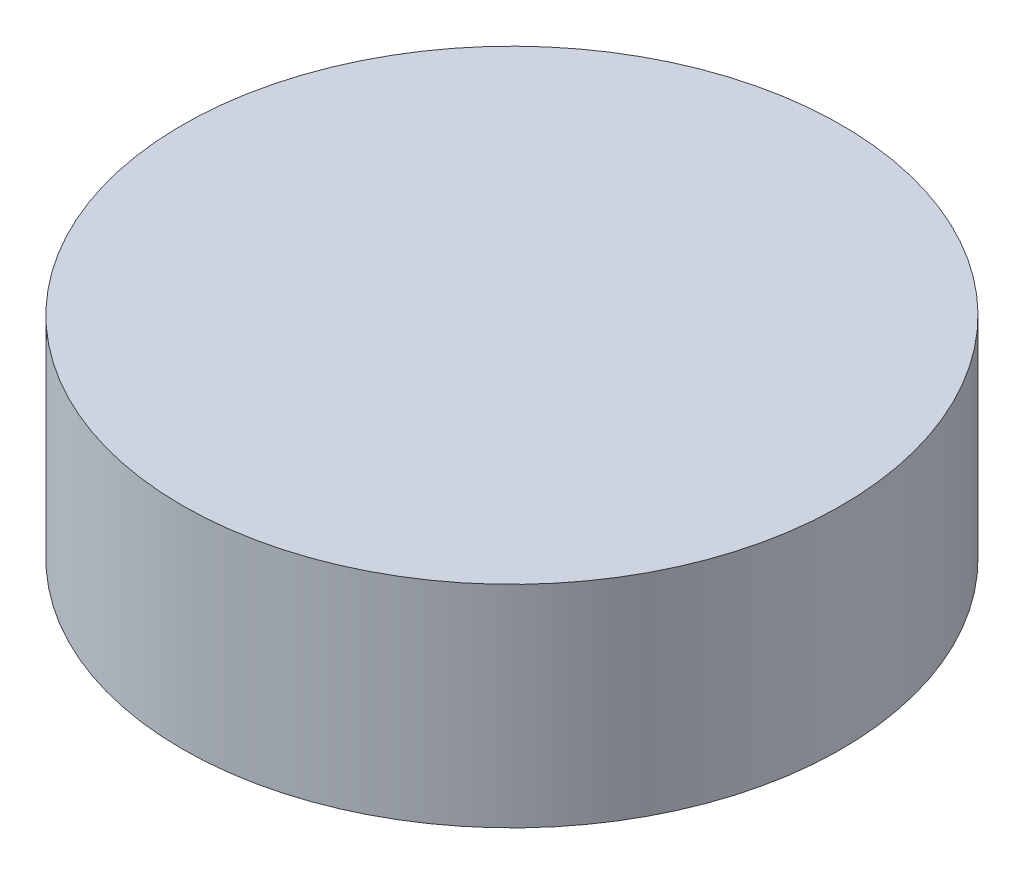
ISO-10303-21;
HEADER;
FILE_DESCRIPTION(('STEP AP214'),'2;1');
FILE_NAME('part.step','',(''),(''),'','','');
FILE_SCHEMA(('AUTOMOTIVE_DESIGN { 1 0 10303 214 1 1 1 1 }'));
ENDSEC;
DATA;
#1=APPLICATION_CONTEXT('core data for automotive mechanical design processes');
#2=APPLICATION_PROTOCOL_DEFINITION('international standard','automotive_design',2000,#1);
#3=PRODUCT_CONTEXT('',#1,'mechanical');
#4=PRODUCT('Part','Part','',(#3));
#5=PRODUCT_RELATED_PRODUCT_CATEGORY('part','',(#4));
#6=PRODUCT_DEFINITION_FORMATION('','',#4);
#7=PRODUCT_DEFINITION_CONTEXT('part definition',#1,'design');
#8=PRODUCT_DEFINITION('design','',#6,#7);
#9=PRODUCT_DEFINITION_SHAPE('','',#8);
#10=(LENGTH_UNIT() NAMED_UNIT(*) SI_UNIT(.MILLI.,.METRE.));
#11=(NAMED_UNIT(*) PLANE_ANGLE_UNIT() SI_UNIT($,.RADIAN.));
#12=(NAMED_UNIT(*) SI_UNIT($,.STERADIAN.) SOLID_ANGLE_UNIT());
#13=UNCERTAINTY_MEASURE_WITH_UNIT(LENGTH_MEASURE(1.E-05),#10,'distance_accuracy_value','');
#14=(GEOMETRIC_REPRESENTATION_CONTEXT(3) GLOBAL_UNCERTAINTY_ASSIGNED_CONTEXT((#13)) GLOBAL_UNIT_ASSIGNED_CONTEXT((#10,
#11,#12)) REPRESENTATION_CONTEXT('',''));
#15=CARTESIAN_POINT('',(0.,0.,0.));
#16=DIRECTION('',(0.,0.,1.));
#17=DIRECTION('',(1.,0.,0.));
#18=AXIS2_PLACEMENT_3D('',#15,#16,#17);
#19=CARTESIAN_POINT('',(0.,24.,0.));
#20=DIRECTION('',(0.,-1.,0.));
#21=DIRECTION('',(0.,0.,-1.));
#22=AXIS2_PLACEMENT_3D('',#19,#20,#21);
#23=CYLINDRICAL_SURFACE('',#22,37.5);
#24=CARTESIAN_POINT('',(0.,24.,0.));
#25=DIRECTION('',(0.,1.,0.));
#26=DIRECTION('',(0.,0.,1.));
#27=AXIS2_PLACEMENT_3D('',#24,#25,#26);
#28=CIRCLE('',#27,37.5);
#29=CARTESIAN_POINT('',(0.,24.,37.5));
#30=VERTEX_POINT('',#29);
#31=EDGE_CURVE('E10',#30,#30,#28,.T.);
#32=ORIENTED_EDGE('',*,*,#31,.F.);
#33=EDGE_LOOP('',(#32));
#34=FACE_BOUND('',#33,.T.);
#35=CARTESIAN_POINT('',(0.,0.,0.));
#36=DIRECTION('',(0.,1.,0.));
#37=DIRECTION('',(0.,0.,1.));
#38=AXIS2_PLACEMENT_3D('',#35,#36,#37);
#39=CIRCLE('',#38,37.5);
#40=CARTESIAN_POINT('',(0.,0.,37.5));
#41=VERTEX_POINT('',#40);
#42=EDGE_CURVE('E38',#41,#41,#39,.T.);
#43=ORIENTED_EDGE('',*,*,#42,.T.);
#44=EDGE_LOOP('',(#43));
#45=FACE_BOUND('',#44,.T.);
#46=ADVANCED_FACE('F35',(#34,#45),#23,.T.);
#47=CARTESIAN_POINT('',(0.,24.,0.));
#48=DIRECTION('',(0.,1.,0.));
#49=DIRECTION('',(0.,0.,1.));
#50=AXIS2_PLACEMENT_3D('',#47,#48,#49);
#51=PLANE('',#50);
#52=ORIENTED_EDGE('',*,*,#31,.T.);
#53=EDGE_LOOP('',(#52));
#54=FACE_BOUND('',#53,.T.);
#55=ADVANCED_FACE('F50',(#54),#51,.T.);
#56=CARTESIAN_POINT('',(0.,0.,0.));
#57=DIRECTION('',(0.,1.,0.));
#58=DIRECTION('',(0.,0.,1.));
#59=AXIS2_PLACEMENT_3D('',#56,#57,#58);
#60=PLANE('',#59);
#61=ORIENTED_EDGE('',*,*,#42,.F.);
#62=EDGE_LOOP('',(#61));
#63=FACE_BOUND('',#62,.T.);
#64=ADVANCED_FACE('F48',(#63),#60,.F.);
#65=CLOSED_SHELL('',(#46,#55,#64));
#66=MANIFOLD_SOLID_BREP('B2',#65);
#67=ADVANCED_BREP_SHAPE_REPRESENTATION('',(#18,#66),#14);
#68=SHAPE_DEFINITION_REPRESENTATION(#9,#67);
ENDSEC;
END-ISO-10303-21;
